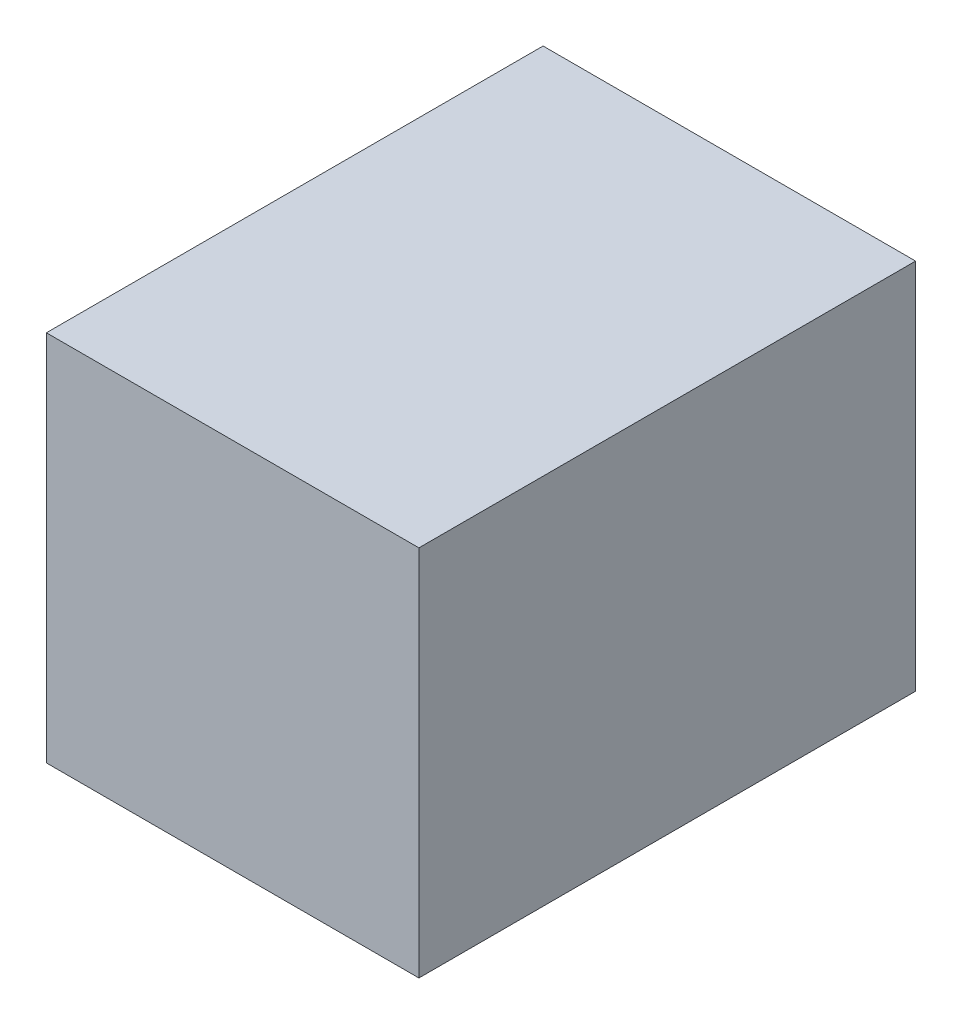
ISO-10303-21;
HEADER;
FILE_DESCRIPTION(('STEP AP214'),'2;1');
FILE_NAME('part.step','',(''),(''),'','','');
FILE_SCHEMA(('AUTOMOTIVE_DESIGN { 1 0 10303 214 1 1 1 1 }'));
ENDSEC;
DATA;
#1=APPLICATION_CONTEXT('core data for automotive mechanical design processes');
#2=APPLICATION_PROTOCOL_DEFINITION('international standard','automotive_design',2000,#1);
#3=PRODUCT_CONTEXT('',#1,'mechanical');
#4=PRODUCT('Part','Part','',(#3));
#5=PRODUCT_RELATED_PRODUCT_CATEGORY('part','',(#4));
#6=PRODUCT_DEFINITION_FORMATION('','',#4);
#7=PRODUCT_DEFINITION_CONTEXT('part definition',#1,'design');
#8=PRODUCT_DEFINITION('design','',#6,#7);
#9=PRODUCT_DEFINITION_SHAPE('','',#8);
#10=(LENGTH_UNIT() NAMED_UNIT(*) SI_UNIT(.MILLI.,.METRE.));
#11=(NAMED_UNIT(*) PLANE_ANGLE_UNIT() SI_UNIT($,.RADIAN.));
#12=(NAMED_UNIT(*) SI_UNIT($,.STERADIAN.) SOLID_ANGLE_UNIT());
#13=UNCERTAINTY_MEASURE_WITH_UNIT(LENGTH_MEASURE(1.E-05),#10,'distance_accuracy_value','');
#14=(GEOMETRIC_REPRESENTATION_CONTEXT(3) GLOBAL_UNCERTAINTY_ASSIGNED_CONTEXT((#13)) GLOBAL_UNIT_ASSIGNED_CONTEXT((#10,
#11,#12)) REPRESENTATION_CONTEXT('',''));
#15=CARTESIAN_POINT('',(0.,0.,0.));
#16=DIRECTION('',(0.,0.,1.));
#17=DIRECTION('',(1.,0.,0.));
#18=AXIS2_PLACEMENT_3D('',#15,#16,#17);
#19=CARTESIAN_POINT('',(3.,3.,8.));
#20=DIRECTION('',(-1.,0.,0.));
#21=DIRECTION('',(0.,-1.,0.));
#22=AXIS2_PLACEMENT_3D('',#19,#20,#21);
#23=PLANE('',#22);
#24=DIRECTION('',(0.,1.,0.));
#25=VECTOR('',#24,1.);
#26=CARTESIAN_POINT('',(3.,3.,0.));
#27=LINE('',#26,#25);
#28=CARTESIAN_POINT('',(3.,-3.,0.));
#29=VERTEX_POINT('',#28);
#30=CARTESIAN_POINT('',(3.,3.,0.));
#31=VERTEX_POINT('',#30);
#32=EDGE_CURVE('E97',#29,#31,#27,.T.);
#33=ORIENTED_EDGE('',*,*,#32,.T.);
#34=DIRECTION('',(0.,0.,-1.));
#35=VECTOR('',#34,1.);
#36=CARTESIAN_POINT('',(3.,3.,8.));
#37=LINE('',#36,#35);
#38=CARTESIAN_POINT('',(3.,3.,8.));
#39=VERTEX_POINT('',#38);
#40=EDGE_CURVE('E11',#39,#31,#37,.T.);
#41=ORIENTED_EDGE('',*,*,#40,.F.);
#42=DIRECTION('',(0.,1.,0.));
#43=VECTOR('',#42,1.);
#44=CARTESIAN_POINT('',(3.,3.,8.));
#45=LINE('',#44,#43);
#46=CARTESIAN_POINT('',(3.,-3.,8.));
#47=VERTEX_POINT('',#46);
#48=EDGE_CURVE('E85',#47,#39,#45,.T.);
#49=ORIENTED_EDGE('',*,*,#48,.F.);
#50=DIRECTION('',(0.,0.,-1.));
#51=VECTOR('',#50,1.);
#52=CARTESIAN_POINT('',(3.,-3.,8.));
#53=LINE('',#52,#51);
#54=EDGE_CURVE('E93',#47,#29,#53,.T.);
#55=ORIENTED_EDGE('',*,*,#54,.T.);
#56=EDGE_LOOP('',(#33,#41,#49,#55));
#57=FACE_BOUND('',#56,.T.);
#58=ADVANCED_FACE('F34',(#57),#23,.F.);
#59=CARTESIAN_POINT('',(-3.,3.,8.));
#60=DIRECTION('',(0.,-1.,0.));
#61=DIRECTION('',(0.,0.,-1.));
#62=AXIS2_PLACEMENT_3D('',#59,#60,#61);
#63=PLANE('',#62);
#64=DIRECTION('',(-1.,0.,0.));
#65=VECTOR('',#64,1.);
#66=CARTESIAN_POINT('',(-3.,3.,0.));
#67=LINE('',#66,#65);
#68=CARTESIAN_POINT('',(-3.,3.,0.));
#69=VERTEX_POINT('',#68);
#70=EDGE_CURVE('E89',#31,#69,#67,.T.);
#71=ORIENTED_EDGE('',*,*,#70,.T.);
#72=DIRECTION('',(0.,0.,-1.));
#73=VECTOR('',#72,1.);
#74=CARTESIAN_POINT('',(-3.,3.,8.));
#75=LINE('',#74,#73);
#76=CARTESIAN_POINT('',(-3.,3.,8.));
#77=VERTEX_POINT('',#76);
#78=EDGE_CURVE('E42',#77,#69,#75,.T.);
#79=ORIENTED_EDGE('',*,*,#78,.F.);
#80=DIRECTION('',(-1.,0.,0.));
#81=VECTOR('',#80,1.);
#82=CARTESIAN_POINT('',(-3.,3.,8.));
#83=LINE('',#82,#81);
#84=EDGE_CURVE('E80',#39,#77,#83,.T.);
#85=ORIENTED_EDGE('',*,*,#84,.F.);
#86=ORIENTED_EDGE('',*,*,#40,.T.);
#87=EDGE_LOOP('',(#71,#79,#85,#86));
#88=FACE_BOUND('',#87,.T.);
#89=ADVANCED_FACE('F88',(#88),#63,.F.);
#90=CARTESIAN_POINT('',(-3.,3.,8.));
#91=DIRECTION('',(1.,0.,0.));
#92=DIRECTION('',(0.,1.,0.));
#93=AXIS2_PLACEMENT_3D('',#90,#91,#92);
#94=PLANE('',#93);
#95=DIRECTION('',(0.,-1.,0.));
#96=VECTOR('',#95,1.);
#97=CARTESIAN_POINT('',(-3.,3.,0.));
#98=LINE('',#97,#96);
#99=CARTESIAN_POINT('',(-3.,-3.,0.));
#100=VERTEX_POINT('',#99);
#101=EDGE_CURVE('E67',#69,#100,#98,.T.);
#102=ORIENTED_EDGE('',*,*,#101,.T.);
#103=DIRECTION('',(0.,0.,-1.));
#104=VECTOR('',#103,1.);
#105=CARTESIAN_POINT('',(-3.,-3.,8.));
#106=LINE('',#105,#104);
#107=CARTESIAN_POINT('',(-3.,-3.,8.));
#108=VERTEX_POINT('',#107);
#109=EDGE_CURVE('E90',#108,#100,#106,.T.);
#110=ORIENTED_EDGE('',*,*,#109,.F.);
#111=DIRECTION('',(0.,-1.,0.));
#112=VECTOR('',#111,1.);
#113=CARTESIAN_POINT('',(-3.,3.,8.));
#114=LINE('',#113,#112);
#115=EDGE_CURVE('E83',#77,#108,#114,.T.);
#116=ORIENTED_EDGE('',*,*,#115,.F.);
#117=ORIENTED_EDGE('',*,*,#78,.T.);
#118=EDGE_LOOP('',(#102,#110,#116,#117));
#119=FACE_BOUND('',#118,.T.);
#120=ADVANCED_FACE('F91',(#119),#94,.F.);
#121=CARTESIAN_POINT('',(-3.,-3.,8.));
#122=DIRECTION('',(0.,1.,0.));
#123=DIRECTION('',(0.,0.,1.));
#124=AXIS2_PLACEMENT_3D('',#121,#122,#123);
#125=PLANE('',#124);
#126=DIRECTION('',(1.,0.,0.));
#127=VECTOR('',#126,1.);
#128=CARTESIAN_POINT('',(-3.,-3.,0.));
#129=LINE('',#128,#127);
#130=EDGE_CURVE('E73',#100,#29,#129,.T.);
#131=ORIENTED_EDGE('',*,*,#130,.T.);
#132=ORIENTED_EDGE('',*,*,#54,.F.);
#133=DIRECTION('',(1.,0.,0.));
#134=VECTOR('',#133,1.);
#135=CARTESIAN_POINT('',(-3.,-3.,8.));
#136=LINE('',#135,#134);
#137=EDGE_CURVE('E50',#108,#47,#136,.T.);
#138=ORIENTED_EDGE('',*,*,#137,.F.);
#139=ORIENTED_EDGE('',*,*,#109,.T.);
#140=EDGE_LOOP('',(#131,#132,#138,#139));
#141=FACE_BOUND('',#140,.T.);
#142=ADVANCED_FACE('F104',(#141),#125,.F.);
#143=CARTESIAN_POINT('',(0.,0.,8.));
#144=DIRECTION('',(0.,0.,1.));
#145=DIRECTION('',(1.,0.,0.));
#146=AXIS2_PLACEMENT_3D('',#143,#144,#145);
#147=PLANE('',#146);
#148=ORIENTED_EDGE('',*,*,#48,.T.);
#149=ORIENTED_EDGE('',*,*,#84,.T.);
#150=ORIENTED_EDGE('',*,*,#115,.T.);
#151=ORIENTED_EDGE('',*,*,#137,.T.);
#152=EDGE_LOOP('',(#148,#149,#150,#151));
#153=FACE_BOUND('',#152,.T.);
#154=ADVANCED_FACE('F81',(#153),#147,.T.);
#155=CARTESIAN_POINT('',(0.,0.,0.));
#156=DIRECTION('',(0.,0.,1.));
#157=DIRECTION('',(1.,0.,0.));
#158=AXIS2_PLACEMENT_3D('',#155,#156,#157);
#159=PLANE('',#158);
#160=ORIENTED_EDGE('',*,*,#32,.F.);
#161=ORIENTED_EDGE('',*,*,#130,.F.);
#162=ORIENTED_EDGE('',*,*,#101,.F.);
#163=ORIENTED_EDGE('',*,*,#70,.F.);
#164=EDGE_LOOP('',(#160,#161,#162,#163));
#165=FACE_BOUND('',#164,.T.);
#166=ADVANCED_FACE('F107',(#165),#159,.F.);
#167=CLOSED_SHELL('',(#58,#89,#120,#142,#154,#166));
#168=MANIFOLD_SOLID_BREP('B2',#167);
#169=ADVANCED_BREP_SHAPE_REPRESENTATION('',(#18,#168),#14);
#170=SHAPE_DEFINITION_REPRESENTATION(#9,#169);
ENDSEC;
END-ISO-10303-21;
